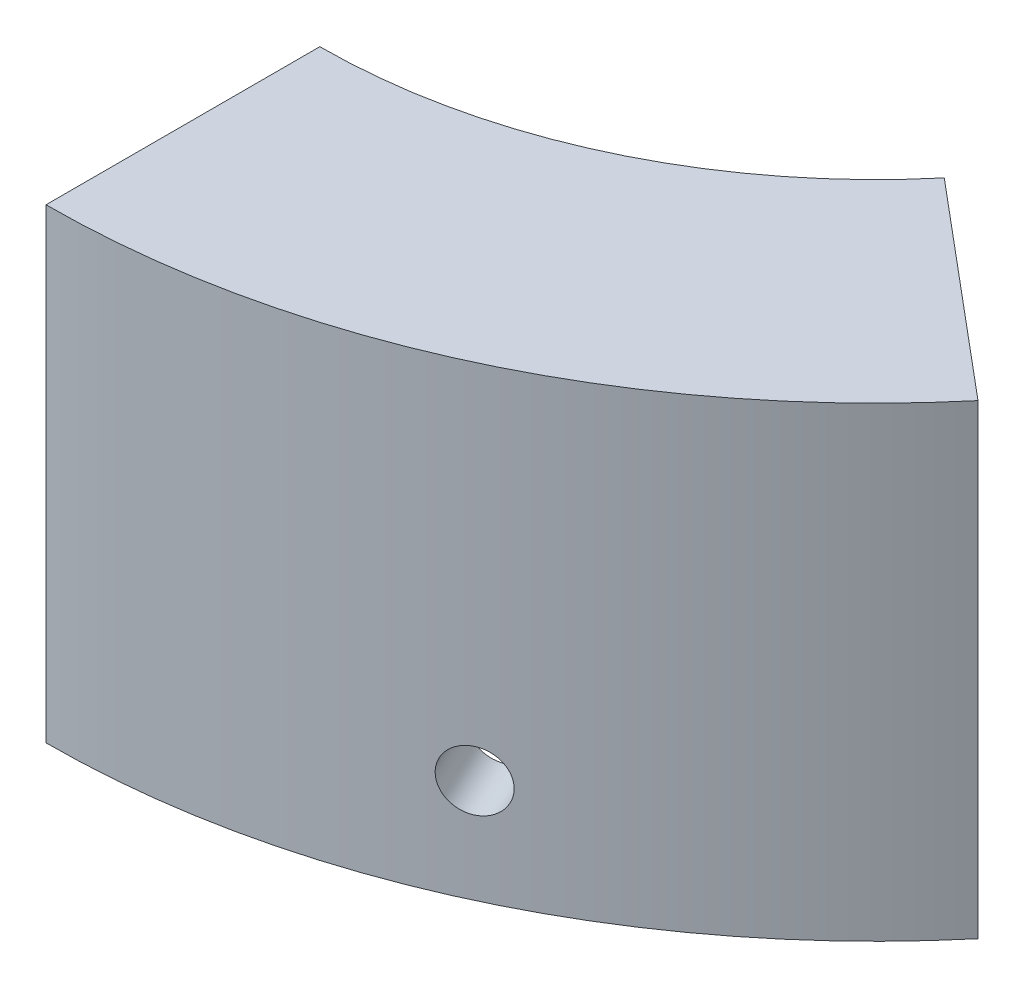
ISO-10303-21;
HEADER;
FILE_DESCRIPTION(('STEP AP214'),'2;1');
FILE_NAME('part.step','',(''),(''),'','','');
FILE_SCHEMA(('AUTOMOTIVE_DESIGN { 1 0 10303 214 1 1 1 1 }'));
ENDSEC;
DATA;
#1=APPLICATION_CONTEXT('core data for automotive mechanical design processes');
#2=APPLICATION_PROTOCOL_DEFINITION('international standard','automotive_design',2000,#1);
#3=PRODUCT_CONTEXT('',#1,'mechanical');
#4=PRODUCT('Part','Part','',(#3));
#5=PRODUCT_RELATED_PRODUCT_CATEGORY('part','',(#4));
#6=PRODUCT_DEFINITION_FORMATION('','',#4);
#7=PRODUCT_DEFINITION_CONTEXT('part definition',#1,'design');
#8=PRODUCT_DEFINITION('design','',#6,#7);
#9=PRODUCT_DEFINITION_SHAPE('','',#8);
#10=(LENGTH_UNIT() NAMED_UNIT(*) SI_UNIT(.MILLI.,.METRE.));
#11=(NAMED_UNIT(*) PLANE_ANGLE_UNIT() SI_UNIT($,.RADIAN.));
#12=(NAMED_UNIT(*) SI_UNIT($,.STERADIAN.) SOLID_ANGLE_UNIT());
#13=UNCERTAINTY_MEASURE_WITH_UNIT(LENGTH_MEASURE(1.E-05),#10,'distance_accuracy_value','');
#14=(GEOMETRIC_REPRESENTATION_CONTEXT(3) GLOBAL_UNCERTAINTY_ASSIGNED_CONTEXT((#13)) GLOBAL_UNIT_ASSIGNED_CONTEXT((#10,
#11,#12)) REPRESENTATION_CONTEXT('',''));
#15=CARTESIAN_POINT('',(0.,0.,0.));
#16=DIRECTION('',(0.,0.,1.));
#17=DIRECTION('',(1.,0.,0.));
#18=AXIS2_PLACEMENT_3D('',#15,#16,#17);
#19=CARTESIAN_POINT('',(0.,11.25,0.));
#20=DIRECTION('',(0.,-1.,0.));
#21=DIRECTION('',(0.,0.,-1.));
#22=AXIS2_PLACEMENT_3D('',#19,#20,#21);
#23=CYLINDRICAL_SURFACE('',#22,60.);
#24=DIRECTION('',(0.,-1.,0.));
#25=VECTOR('',#24,1.);
#26=CARTESIAN_POINT('',(0.,11.25,60.));
#27=LINE('',#26,#25);
#28=CARTESIAN_POINT('',(0.,11.25,60.));
#29=VERTEX_POINT('',#28);
#30=CARTESIAN_POINT('',(0.,-22.45,60.));
#31=VERTEX_POINT('',#30);
#32=EDGE_CURVE('E188',#29,#31,#27,.T.);
#33=ORIENTED_EDGE('',*,*,#32,.T.);
#34=CARTESIAN_POINT('',(0.,-22.45,0.));
#35=DIRECTION('',(0.,-1.,0.));
#36=DIRECTION('',(0.,0.,-1.));
#37=AXIS2_PLACEMENT_3D('',#34,#35,#36);
#38=CIRCLE('',#37,60.);
#39=CARTESIAN_POINT('',(45.9626665871388,-22.45,38.5672565811923));
#40=VERTEX_POINT('',#39);
#41=EDGE_CURVE('E145',#40,#31,#38,.T.);
#42=ORIENTED_EDGE('',*,*,#41,.F.);
#43=DIRECTION('',(0.,-1.,0.));
#44=VECTOR('',#43,1.);
#45=CARTESIAN_POINT('',(45.9626665871387,11.25,38.5672565811923));
#46=LINE('',#45,#44);
#47=CARTESIAN_POINT('',(45.9626665871387,11.25,38.5672565811923));
#48=VERTEX_POINT('',#47);
#49=EDGE_CURVE('E141',#48,#40,#46,.T.);
#50=ORIENTED_EDGE('',*,*,#49,.F.);
#51=CARTESIAN_POINT('',(0.,11.25,0.));
#52=DIRECTION('',(0.,1.,0.));
#53=DIRECTION('',(0.,0.,1.));
#54=AXIS2_PLACEMENT_3D('',#51,#52,#53);
#55=CIRCLE('',#54,60.);
#56=EDGE_CURVE('E166',#29,#48,#55,.T.);
#57=ORIENTED_EDGE('',*,*,#56,.F.);
#58=EDGE_LOOP('',(#33,#42,#50,#57));
#59=FACE_BOUND('',#58,.T.);
#60=CARTESIAN_POINT('',(23.3922491254643,-14.95,55.2521735396194));
#61=CARTESIAN_POINT('',(23.3922541854339,-15.0707248420507,55.2521717531925));
#62=CARTESIAN_POINT('',(23.4016513651294,-15.1915362342641,55.2481958127734));
#63=CARTESIAN_POINT('',(23.4389939015818,-15.429828956038,55.2323633417633));
#64=CARTESIAN_POINT('',(23.4669613419157,-15.5473061469481,55.220497428468));
#65=CARTESIAN_POINT('',(23.5406066530726,-15.7754439014427,55.1891423282363));
#66=CARTESIAN_POINT('',(23.5862757723697,-15.8861078021664,55.1696569082626));
#67=CARTESIAN_POINT('',(23.6939568640016,-16.0975036637949,55.1234961061498));
#68=CARTESIAN_POINT('',(23.7559648785194,-16.198238021852,55.0968224651981));
#69=CARTESIAN_POINT('',(23.8945332200248,-16.3870054728275,55.0368691597757));
#70=CARTESIAN_POINT('',(23.9711008917726,-16.4750321156179,55.003586160773));
#71=CARTESIAN_POINT('',(24.1365230414772,-16.635830823503,54.9311968676657));
#72=CARTESIAN_POINT('',(24.2253780114072,-16.7086022774988,54.8920903403871));
#73=CARTESIAN_POINT('',(24.4128028804114,-16.8368381175184,54.8089915117414));
#74=CARTESIAN_POINT('',(24.5113752076527,-16.8922981632809,54.7649979888649));
#75=CARTESIAN_POINT('',(24.7153552405868,-16.9843088158283,54.6732449126882));
#76=CARTESIAN_POINT('',(24.8207629130422,-17.0208595145535,54.6254853777004));
#77=CARTESIAN_POINT('',(25.0353281996155,-17.0739987719034,54.5274815035325));
#78=CARTESIAN_POINT('',(25.1444841696664,-17.0905959702894,54.4772382496084));
#79=CARTESIAN_POINT('',(25.3634667695889,-17.1033837281213,54.3756298426833));
#80=CARTESIAN_POINT('',(25.4732933961575,-17.0995743879957,54.324264695205));
#81=CARTESIAN_POINT('',(25.6904517219533,-17.0716644472431,54.2219060594013));
#82=CARTESIAN_POINT('',(25.7977845433253,-17.0475731620519,54.170912411291));
#83=CARTESIAN_POINT('',(26.006992899415,-16.9797976151706,54.0707848874392));
#84=CARTESIAN_POINT('',(26.1088684195068,-16.9361133009726,54.0216510166822));
#85=CARTESIAN_POINT('',(26.3043498333329,-16.8303810610633,53.9267373565924));
#86=CARTESIAN_POINT('',(26.3979538006695,-16.7683288721379,53.8809583490097));
#87=CARTESIAN_POINT('',(26.5742832138732,-16.6276254653688,53.7942110526802));
#88=CARTESIAN_POINT('',(26.6570086223979,-16.5489741905486,53.7532427804469));
#89=CARTESIAN_POINT('',(26.8093585088674,-16.3772525227586,53.6774213048454));
#90=CARTESIAN_POINT('',(26.8789755951441,-16.2841740480264,53.6425715524008));
#91=CARTESIAN_POINT('',(27.0031533694194,-16.0862686136449,53.580169404268));
#92=CARTESIAN_POINT('',(27.0577140546456,-15.9814416518322,53.5526170099235));
#93=CARTESIAN_POINT('',(27.1502977204834,-15.76301022928,53.5057383827682));
#94=CARTESIAN_POINT('',(27.188320455097,-15.649405638005,53.4864122723213));
#95=CARTESIAN_POINT('',(27.2467957832979,-15.4166458929548,53.4566479052023));
#96=CARTESIAN_POINT('',(27.2672484449549,-15.2974907606855,53.4462096140972));
#97=CARTESIAN_POINT('',(27.2900232689762,-15.05708331066,53.4345842785768));
#98=CARTESIAN_POINT('',(27.2923555089991,-14.9358321961957,53.4333920919483));
#99=CARTESIAN_POINT('',(27.2788529381853,-14.6946122999906,53.4402866537407));
#100=CARTESIAN_POINT('',(27.263018157751,-14.5746435161043,53.4483733866334));
#101=CARTESIAN_POINT('',(27.2136166684765,-14.3394253603243,53.4735432535675));
#102=CARTESIAN_POINT('',(27.1800545523551,-14.2241747743903,53.4906240574616));
#103=CARTESIAN_POINT('',(27.0961095525794,-14.0016272536743,53.5331957681873));
#104=CARTESIAN_POINT('',(27.0457266197751,-13.894330342134,53.5586866995931));
#105=CARTESIAN_POINT('',(26.929479694029,-13.6906838732884,53.6172299205547));
#106=CARTESIAN_POINT('',(26.8636088615042,-13.5943391805383,53.6502855505705));
#107=CARTESIAN_POINT('',(26.7181903019912,-13.4153809036256,53.7228526098402));
#108=CARTESIAN_POINT('',(26.6386425275199,-13.3327673671364,53.7623640615071));
#109=CARTESIAN_POINT('',(26.4680066288881,-13.1835787012585,53.8465752296335));
#110=CARTESIAN_POINT('',(26.3769132852548,-13.1170108654874,53.8912772918713));
#111=CARTESIAN_POINT('',(26.1857261034243,-13.0018530746926,53.9844333222458));
#112=CARTESIAN_POINT('',(26.0856322900676,-12.9532630700535,54.0328872800275));
#113=CARTESIAN_POINT('',(25.8792526677646,-12.8754530241962,54.1320364768231));
#114=CARTESIAN_POINT('',(25.772968371504,-12.8462282723728,54.1827311675749));
#115=CARTESIAN_POINT('',(25.5571679252394,-12.8079628745986,54.2848543488288));
#116=CARTESIAN_POINT('',(25.4476517817606,-12.7989221878986,54.3362828378491));
#117=CARTESIAN_POINT('',(25.22855067912,-12.8012820814146,54.4383580677768));
#118=CARTESIAN_POINT('',(25.1189657931168,-12.8126711877716,54.4890052313837));
#119=CARTESIAN_POINT('',(24.9027912327665,-12.8555437355981,54.5881409727783));
#120=CARTESIAN_POINT('',(24.7962015642937,-12.8870272164737,54.6366295463327));
#121=CARTESIAN_POINT('',(24.5890790970899,-12.9691929072669,54.7301572492786));
#122=CARTESIAN_POINT('',(24.4885463901186,-13.0198754079545,54.775196326415));
#123=CARTESIAN_POINT('',(24.2964509051454,-13.1389974023433,54.8606738936362));
#124=CARTESIAN_POINT('',(24.2048878147176,-13.2074362772588,54.9011125439692));
#125=CARTESIAN_POINT('',(24.0333533285727,-13.3601654899175,54.9764196972454));
#126=CARTESIAN_POINT('',(23.9533872218165,-13.444463020206,55.0112856594244));
#127=CARTESIAN_POINT('',(23.8074220173936,-13.6265269797352,55.0746130780009));
#128=CARTESIAN_POINT('',(23.741426377667,-13.7242967337284,55.1030729488865));
#129=CARTESIAN_POINT('',(23.6253342186177,-13.9305772731139,55.1529472524422));
#130=CARTESIAN_POINT('',(23.5752492183618,-14.0390957662096,55.1743565810336));
#131=CARTESIAN_POINT('',(23.4925766984614,-14.2636557336775,55.2096085748595));
#132=CARTESIAN_POINT('',(23.4599683610407,-14.3796880721617,55.2234602429517));
#133=CARTESIAN_POINT('',(23.4218401466654,-14.5720421027067,55.2396383125264));
#134=CARTESIAN_POINT('',(23.4107580872576,-14.6471158642978,55.2443342925273));
#135=CARTESIAN_POINT('',(23.395960986367,-14.7981149961081,55.250602467416));
#136=CARTESIAN_POINT('',(23.3922459417497,-14.8740403659648,55.2521746636328));
#137=CARTESIAN_POINT('',(23.3922491254643,-14.95,55.2521735396194));
#138=B_SPLINE_CURVE_WITH_KNOTS('',3,(#60,#61,#62,#63,#64,#65,#66,#67,#68,#69,#70,#71,#72,#73,
#74,#75,#76,#77,#78,#79,#80,#81,#82,#83,#84,#85,#86,#87,#88,#89,#90,#91,#92,#93,#94,#95,#96,#97,
#98,#99,#100,#101,#102,#103,#104,#105,#106,#107,#108,#109,#110,#111,#112,#113,#114,#115,#116,
#117,#118,#119,#120,#121,#122,#123,#124,#125,#126,#127,#128,#129,#130,#131,#132,#133,#134,#135,
#136,#137),.UNSPECIFIED.,.T.,.F.,(4,2,2,2,2,2,2,2,2,2,2,2,2,2,2,2,2,2,2,2,2,2,2,2,2,2,2,2,2,2,2,
2,2,2,2,2,2,2,4),(0.,0.361897258983272,0.724225655357459,1.08637514835407,1.44843699736979,
1.81068197887758,2.17294146857742,2.5352917100109,2.8976401896225,3.25983171766565,
3.62202146322321,3.98404494682679,4.34606940062871,4.70817794687758,5.07028773608951,
5.43260110831141,5.79491454724964,6.15723337532554,6.51955079970539,6.88166670709439,
7.24378200848348,7.6058035406434,7.96782613063114,8.33000889402181,8.69219291485195,
9.05454125827569,9.41688860167998,9.77914777156541,10.1414062100911,10.5034612593326,
10.8655170185841,11.2275782614049,11.5896268885744,11.9518401171281,12.314142895364,
12.6767073807731,13.0388390228668,13.2665435663526,13.4942480129584),.UNSPECIFIED.);
#139=CARTESIAN_POINT('',(23.3922491254643,-14.95,55.2521735396194));
#140=VERTEX_POINT('',#139);
#141=EDGE_CURVE('E152',#140,#140,#138,.T.);
#142=ORIENTED_EDGE('',*,*,#141,.F.);
#143=EDGE_LOOP('',(#142));
#144=FACE_BOUND('',#143,.T.);
#145=ADVANCED_FACE('F39',(#59,#144),#23,.T.);
#146=CARTESIAN_POINT('',(0.,-22.45,0.));
#147=DIRECTION('',(0.,1.,0.));
#148=DIRECTION('',(0.,0.,1.));
#149=AXIS2_PLACEMENT_3D('',#146,#147,#148);
#150=CYLINDRICAL_SURFACE('',#149,55.2);
#151=CARTESIAN_POINT('',(0.,6.25,0.));
#152=DIRECTION('',(0.,-1.,0.));
#153=DIRECTION('',(0.,0.,-1.));
#154=AXIS2_PLACEMENT_3D('',#151,#152,#153);
#155=CIRCLE('',#154,55.2);
#156=CARTESIAN_POINT('',(42.2856532601677,6.25,35.4818760546969));
#157=VERTEX_POINT('',#156);
#158=CARTESIAN_POINT('',(0.,6.25,55.2));
#159=VERTEX_POINT('',#158);
#160=EDGE_CURVE('E131',#157,#159,#155,.T.);
#161=ORIENTED_EDGE('',*,*,#160,.F.);
#162=DIRECTION('',(0.,1.,0.));
#163=VECTOR('',#162,1.);
#164=CARTESIAN_POINT('',(42.2856532601677,-22.45,35.4818760546969));
#165=LINE('',#164,#163);
#166=CARTESIAN_POINT('',(42.2856532601677,-22.45,35.4818760546969));
#167=VERTEX_POINT('',#166);
#168=EDGE_CURVE('E124',#167,#157,#165,.T.);
#169=ORIENTED_EDGE('',*,*,#168,.F.);
#170=CARTESIAN_POINT('',(0.,-22.45,0.));
#171=DIRECTION('',(0.,-1.,0.));
#172=DIRECTION('',(0.,0.,-1.));
#173=AXIS2_PLACEMENT_3D('',#170,#171,#172);
#174=CIRCLE('',#173,55.2);
#175=CARTESIAN_POINT('',(0.,-22.45,55.2));
#176=VERTEX_POINT('',#175);
#177=EDGE_CURVE('E129',#167,#176,#174,.T.);
#178=ORIENTED_EDGE('',*,*,#177,.T.);
#179=DIRECTION('',(0.,1.,0.));
#180=VECTOR('',#179,1.);
#181=CARTESIAN_POINT('',(0.,-22.45,55.2));
#182=LINE('',#181,#180);
#183=EDGE_CURVE('E134',#176,#159,#182,.T.);
#184=ORIENTED_EDGE('',*,*,#183,.T.);
#185=EDGE_LOOP('',(#161,#169,#178,#184));
#186=FACE_BOUND('',#185,.T.);
#187=CARTESIAN_POINT('',(21.3622643640661,-14.95,50.898857170272));
#188=CARTESIAN_POINT('',(21.3622694405158,-15.0707172908338,50.8988554256321));
#189=CARTESIAN_POINT('',(21.3716789911995,-15.1915209472526,50.8949090210859));
#190=CARTESIAN_POINT('',(21.4090693215218,-15.4297978923482,50.8791916819157));
#191=CARTESIAN_POINT('',(21.4370721682093,-15.5472670505989,50.8674114498586));
#192=CARTESIAN_POINT('',(21.5108063948959,-15.7753886985463,50.8362744564915));
#193=CARTESIAN_POINT('',(21.556528961326,-15.8860445454403,50.8169214617335));
#194=CARTESIAN_POINT('',(21.6643282349254,-16.0974258952511,50.7710576658738));
#195=CARTESIAN_POINT('',(21.726401000763,-16.1981537833423,50.7445485897579));
#196=CARTESIAN_POINT('',(21.8651074100081,-16.386918079417,50.6849362480143));
#197=CARTESIAN_POINT('',(21.9417494579048,-16.4749471100826,50.6518291757064));
#198=CARTESIAN_POINT('',(22.1073176286763,-16.6357523274736,50.5797849021829));
#199=CARTESIAN_POINT('',(22.1962442451878,-16.7085279009658,50.5408474666776));
#200=CARTESIAN_POINT('',(22.3838065423846,-16.8367769812635,50.4580588232859));
#201=CARTESIAN_POINT('',(22.4824451223515,-16.8922453006613,50.4142061475244));
#202=CARTESIAN_POINT('',(22.6865409113032,-16.9842718698095,50.3226922596357));
#203=CARTESIAN_POINT('',(22.791998083599,-17.0208302213001,50.2750310680008));
#204=CARTESIAN_POINT('',(23.0066314595807,-17.0739811439652,50.1771741441197));
#205=CARTESIAN_POINT('',(23.1158057314189,-17.090583928341,50.126979722092));
#206=CARTESIAN_POINT('',(23.3347991188611,-17.1033839191848,50.0254107089069));
#207=CARTESIAN_POINT('',(23.4446182309236,-17.0995812376133,49.9740361242263));
#208=CARTESIAN_POINT('',(23.6617267213326,-17.0716867802583,49.8716060703064));
#209=CARTESIAN_POINT('',(23.7690174395056,-17.04760601046,49.8205504430922));
#210=CARTESIAN_POINT('',(23.9781204132354,-16.9798559848806,49.7202493672024));
#211=CARTESIAN_POINT('',(24.0799326525108,-16.9361866708882,49.6710039239064));
#212=CARTESIAN_POINT('',(24.2752775540777,-16.8304865683802,49.5758279947255));
#213=CARTESIAN_POINT('',(24.3688079378394,-16.7684507470791,49.5298984217509));
#214=CARTESIAN_POINT('',(24.5449845787538,-16.6277823033014,49.4428296484158));
#215=CARTESIAN_POINT('',(24.6276307909703,-16.549149612307,49.4016904678329));
#216=CARTESIAN_POINT('',(24.7798343877172,-16.3774572583098,49.3255215086198));
#217=CARTESIAN_POINT('',(24.849383042005,-16.2843880474035,49.2904958060887));
#218=CARTESIAN_POINT('',(24.973434547175,-16.0864981667477,49.2277606111358));
#219=CARTESIAN_POINT('',(25.0279373950865,-15.981677494678,49.2000511201583));
#220=CARTESIAN_POINT('',(25.120423476875,-15.763254589533,49.1528944476081));
#221=CARTESIAN_POINT('',(25.1584064139596,-15.6496521987308,49.1334474144767));
#222=CARTESIAN_POINT('',(25.216825013252,-15.4168931317498,49.1034909472003));
#223=CARTESIAN_POINT('',(25.2372607556765,-15.2977364809648,49.0929814721975));
#224=CARTESIAN_POINT('',(25.2600260401029,-15.0573351819678,49.0812719054578));
#225=CARTESIAN_POINT('',(25.2623674707566,-14.9360919572149,49.0800657011189));
#226=CARTESIAN_POINT('',(25.2489123611905,-14.6948854804683,49.0869889035784));
#227=CARTESIAN_POINT('',(25.2331158569941,-14.574922225933,49.0951182918356));
#228=CARTESIAN_POINT('',(25.1838184577965,-14.339718375219,49.1204239319036));
#229=CARTESIAN_POINT('',(25.1503229870618,-14.2244763437634,49.1375974119335));
#230=CARTESIAN_POINT('',(25.0665337704626,-14.0019421093365,49.1803932988871));
#231=CARTESIAN_POINT('',(25.0162399662586,-13.8946499339761,49.2060157351536));
#232=CARTESIAN_POINT('',(24.9001810184495,-13.690999539408,49.2648475496869));
#233=CARTESIAN_POINT('',(24.8344078033248,-13.5946470635407,49.2980608858593));
#234=CARTESIAN_POINT('',(24.6891866292014,-13.4156688832327,49.3709494187668));
#235=CARTESIAN_POINT('',(24.6097386150886,-13.3330432341184,49.4106246415456));
#236=CARTESIAN_POINT('',(24.4392869135116,-13.1838194413456,49.4951542324858));
#237=CARTESIAN_POINT('',(24.348277051962,-13.1172299164808,49.5400113666452));
#238=CARTESIAN_POINT('',(24.157237498651,-13.0020275133764,49.6334480778319));
#239=CARTESIAN_POINT('',(24.0572078345509,-12.9534145800098,49.6820276434435));
#240=CARTESIAN_POINT('',(23.8509347435121,-12.8755604131166,49.781382084593));
#241=CARTESIAN_POINT('',(23.7446931082972,-12.8463136235015,49.8321563260278));
#242=CARTESIAN_POINT('',(23.5289482098183,-12.8080037451981,49.9343853426438));
#243=CARTESIAN_POINT('',(23.4194449554035,-12.7989406017547,49.9858401159784));
#244=CARTESIAN_POINT('',(23.2003503259431,-12.8012559096318,50.0879061311319));
#245=CARTESIAN_POINT('',(23.0907590574566,-12.8126208120851,50.1385179095972));
#246=CARTESIAN_POINT('',(22.874542823071,-12.8554416696801,50.2375301448695));
#247=CARTESIAN_POINT('',(22.7679178629521,-12.8868976639688,50.2859305973678));
#248=CARTESIAN_POINT('',(22.5607000357985,-12.9690053842659,50.3792391456441));
#249=CARTESIAN_POINT('',(22.4601072531721,-13.0196573788116,50.4241471925556));
#250=CARTESIAN_POINT('',(22.2678724858564,-13.1387160718354,50.5093350047404));
#251=CARTESIAN_POINT('',(22.1762301965425,-13.2071221657736,50.5496149275374));
#252=CARTESIAN_POINT('',(22.0045167398937,-13.3597926530075,50.6245991794193));
#253=CARTESIAN_POINT('',(21.9244520333264,-13.4440658408754,50.6593003965548));
#254=CARTESIAN_POINT('',(21.7782890954002,-13.6260847085943,50.7223074909036));
#255=CARTESIAN_POINT('',(21.7121943185973,-13.7238337109633,50.7506117863728));
#256=CARTESIAN_POINT('',(21.5959097870859,-13.9300825186774,50.8002036647812));
#257=CARTESIAN_POINT('',(21.54573227728,-14.0385905169322,50.8214858462215));
#258=CARTESIAN_POINT('',(21.4628934933082,-14.2631362674082,50.8565260806417));
#259=CARTESIAN_POINT('',(21.4302114078631,-14.3791648885453,50.8702930735277));
#260=CARTESIAN_POINT('',(21.3919671505231,-14.5716015509966,50.8863830453759));
#261=CARTESIAN_POINT('',(21.3808433136291,-14.6467614986251,50.8910562393931));
#262=CARTESIAN_POINT('',(21.3659903232497,-14.7979362058161,50.8972938505956));
#263=CARTESIAN_POINT('',(21.3622611660229,-14.8739509649459,50.8988582693539));
#264=CARTESIAN_POINT('',(21.3622643640661,-14.95,50.898857170272));
#265=B_SPLINE_CURVE_WITH_KNOTS('',3,(#187,#188,#189,#190,#191,#192,#193,#194,#195,#196,#197,
#198,#199,#200,#201,#202,#203,#204,#205,#206,#207,#208,#209,#210,#211,#212,#213,#214,#215,#216,
#217,#218,#219,#220,#221,#222,#223,#224,#225,#226,#227,#228,#229,#230,#231,#232,#233,#234,#235,
#236,#237,#238,#239,#240,#241,#242,#243,#244,#245,#246,#247,#248,#249,#250,#251,#252,#253,#254,
#255,#256,#257,#258,#259,#260,#261,#262,#263,#264),.UNSPECIFIED.,.T.,.F.,(4,2,2,2,2,2,2,2,2,2,2,
2,2,2,2,2,2,2,2,2,2,2,2,2,2,2,2,2,2,2,2,2,2,2,2,2,2,2,4),(0.,0.361874276229291,
0.724178804587717,1.08630335796686,1.44834069841001,1.81058752230407,2.17284890677703,
2.53521876578399,2.89758667513078,3.25976904655569,3.62194943076489,3.98393336723073,
4.3459183794131,4.70800267458692,5.07008846460504,5.43241475701872,5.79474112096663,
6.15707399410755,6.51940521084222,6.8814983419142,7.24359075384431,7.60557225831011,
7.96755501992841,8.32972695217413,8.69190034412905,9.05426795794164,9.41663446050764,
9.77889695611439,10.1411584689594,10.5031798011143,10.8652018386611,11.227228940802,
11.589243717273,11.9514597396554,12.3137652281513,12.6763487604115,13.0385000259541,
13.2664723673809,13.4944445934643),.UNSPECIFIED.);
#266=CARTESIAN_POINT('',(21.3622643640661,-14.95,50.898857170272));
#267=VERTEX_POINT('',#266);
#268=EDGE_CURVE('E43',#267,#267,#265,.T.);
#269=ORIENTED_EDGE('',*,*,#268,.T.);
#270=EDGE_LOOP('',(#269));
#271=FACE_BOUND('',#270,.T.);
#272=ADVANCED_FACE('F126',(#186,#271),#150,.F.);
#273=CARTESIAN_POINT('',(0.,6.25,0.));
#274=DIRECTION('',(0.,-1.,0.));
#275=DIRECTION('',(0.,0.,-1.));
#276=AXIS2_PLACEMENT_3D('',#273,#274,#275);
#277=CYLINDRICAL_SURFACE('',#276,43.2);
#278=CARTESIAN_POINT('',(0.,0.,0.));
#279=DIRECTION('',(0.,1.,0.));
#280=DIRECTION('',(0.,0.,1.));
#281=AXIS2_PLACEMENT_3D('',#278,#279,#280);
#282=CIRCLE('',#281,43.2);
#283=CARTESIAN_POINT('',(0.,0.,43.2));
#284=VERTEX_POINT('',#283);
#285=CARTESIAN_POINT('',(33.0931199427399,0.,27.7684247384584));
#286=VERTEX_POINT('',#285);
#287=EDGE_CURVE('E190',#284,#286,#282,.T.);
#288=ORIENTED_EDGE('',*,*,#287,.F.);
#289=DIRECTION('',(0.,-1.,0.));
#290=VECTOR('',#289,1.);
#291=CARTESIAN_POINT('',(0.,6.25,43.2));
#292=LINE('',#291,#290);
#293=CARTESIAN_POINT('',(0.,6.25,43.2));
#294=VERTEX_POINT('',#293);
#295=EDGE_CURVE('E11',#294,#284,#292,.T.);
#296=ORIENTED_EDGE('',*,*,#295,.F.);
#297=CARTESIAN_POINT('',(0.,6.25,0.));
#298=DIRECTION('',(0.,1.,0.));
#299=DIRECTION('',(0.,0.,1.));
#300=AXIS2_PLACEMENT_3D('',#297,#298,#299);
#301=CIRCLE('',#300,43.2);
#302=CARTESIAN_POINT('',(33.0931199427399,6.25,27.7684247384584));
#303=VERTEX_POINT('',#302);
#304=EDGE_CURVE('E191',#294,#303,#301,.T.);
#305=ORIENTED_EDGE('',*,*,#304,.T.);
#306=DIRECTION('',(0.,-1.,0.));
#307=VECTOR('',#306,1.);
#308=CARTESIAN_POINT('',(33.0931199427399,6.25,27.7684247384584));
#309=LINE('',#308,#307);
#310=EDGE_CURVE('E62',#303,#286,#309,.T.);
#311=ORIENTED_EDGE('',*,*,#310,.T.);
#312=EDGE_LOOP('',(#288,#296,#305,#311));
#313=FACE_BOUND('',#312,.T.);
#314=ADVANCED_FACE('F41',(#313),#277,.F.);
#315=CARTESIAN_POINT('',(0.,6.25,0.));
#316=DIRECTION('',(1.,0.,0.));
#317=DIRECTION('',(0.,0.,-1.));
#318=AXIS2_PLACEMENT_3D('',#315,#316,#317);
#319=PLANE('',#318);
#320=DIRECTION('',(0.,0.,1.));
#321=VECTOR('',#320,1.);
#322=CARTESIAN_POINT('',(0.,0.,0.));
#323=LINE('',#322,#321);
#324=CARTESIAN_POINT('',(0.,0.,46.8));
#325=VERTEX_POINT('',#324);
#326=EDGE_CURVE('E198',#284,#325,#323,.T.);
#327=ORIENTED_EDGE('',*,*,#326,.T.);
#328=DIRECTION('',(0.,-1.,0.));
#329=VECTOR('',#328,1.);
#330=CARTESIAN_POINT('',(0.,6.25,46.8));
#331=LINE('',#330,#329);
#332=CARTESIAN_POINT('',(0.,6.25,46.8));
#333=VERTEX_POINT('',#332);
#334=EDGE_CURVE('E54',#333,#325,#331,.T.);
#335=ORIENTED_EDGE('',*,*,#334,.F.);
#336=DIRECTION('',(0.,0.,1.));
#337=VECTOR('',#336,1.);
#338=CARTESIAN_POINT('',(0.,6.25,0.));
#339=LINE('',#338,#337);
#340=EDGE_CURVE('E133',#333,#159,#339,.T.);
#341=ORIENTED_EDGE('',*,*,#340,.T.);
#342=ORIENTED_EDGE('',*,*,#183,.F.);
#343=DIRECTION('',(0.,0.,-1.));
#344=VECTOR('',#343,1.);
#345=CARTESIAN_POINT('',(0.,-22.45,0.));
#346=LINE('',#345,#344);
#347=EDGE_CURVE('E149',#31,#176,#346,.T.);
#348=ORIENTED_EDGE('',*,*,#347,.F.);
#349=ORIENTED_EDGE('',*,*,#32,.F.);
#350=DIRECTION('',(0.,0.,1.));
#351=VECTOR('',#350,1.);
#352=CARTESIAN_POINT('',(0.,11.25,0.));
#353=LINE('',#352,#351);
#354=CARTESIAN_POINT('',(0.,11.25,40.2));
#355=VERTEX_POINT('',#354);
#356=EDGE_CURVE('E163',#355,#29,#353,.T.);
#357=ORIENTED_EDGE('',*,*,#356,.F.);
#358=DIRECTION('',(0.,-1.,0.));
#359=VECTOR('',#358,1.);
#360=CARTESIAN_POINT('',(0.,11.25,40.2));
#361=LINE('',#360,#359);
#362=CARTESIAN_POINT('',(0.,6.25,40.2));
#363=VERTEX_POINT('',#362);
#364=EDGE_CURVE('E174',#355,#363,#361,.T.);
#365=ORIENTED_EDGE('',*,*,#364,.T.);
#366=EDGE_CURVE('E175',#363,#294,#339,.T.);
#367=ORIENTED_EDGE('',*,*,#366,.T.);
#368=ORIENTED_EDGE('',*,*,#295,.T.);
#369=EDGE_LOOP('',(#327,#335,#341,#342,#348,#349,#357,#365,#367,#368));
#370=FACE_BOUND('',#369,.T.);
#371=ADVANCED_FACE('F218',(#370),#319,.F.);
#372=CARTESIAN_POINT('',(0.,6.25,0.));
#373=DIRECTION('',(0.,-1.,0.));
#374=DIRECTION('',(0.,0.,-1.));
#375=AXIS2_PLACEMENT_3D('',#372,#373,#374);
#376=CYLINDRICAL_SURFACE('',#375,46.8);
#377=CARTESIAN_POINT('',(0.,0.,0.));
#378=DIRECTION('',(0.,1.,0.));
#379=DIRECTION('',(0.,0.,1.));
#380=AXIS2_PLACEMENT_3D('',#377,#378,#379);
#381=CIRCLE('',#380,46.8);
#382=CARTESIAN_POINT('',(35.8508799379682,0.,30.08246013333));
#383=VERTEX_POINT('',#382);
#384=EDGE_CURVE('E200',#325,#383,#381,.T.);
#385=ORIENTED_EDGE('',*,*,#384,.T.);
#386=DIRECTION('',(0.,-1.,0.));
#387=VECTOR('',#386,1.);
#388=CARTESIAN_POINT('',(35.8508799379682,6.25,30.08246013333));
#389=LINE('',#388,#387);
#390=CARTESIAN_POINT('',(35.8508799379682,6.25,30.08246013333));
#391=VERTEX_POINT('',#390);
#392=EDGE_CURVE('E78',#391,#383,#389,.T.);
#393=ORIENTED_EDGE('',*,*,#392,.F.);
#394=CARTESIAN_POINT('',(0.,6.25,0.));
#395=DIRECTION('',(0.,1.,0.));
#396=DIRECTION('',(0.,0.,1.));
#397=AXIS2_PLACEMENT_3D('',#394,#395,#396);
#398=CIRCLE('',#397,46.8);
#399=EDGE_CURVE('E193',#333,#391,#398,.T.);
#400=ORIENTED_EDGE('',*,*,#399,.F.);
#401=ORIENTED_EDGE('',*,*,#334,.T.);
#402=EDGE_LOOP('',(#385,#393,#400,#401));
#403=FACE_BOUND('',#402,.T.);
#404=ADVANCED_FACE('F210',(#403),#376,.T.);
#405=CARTESIAN_POINT('',(0.,6.25,0.));
#406=DIRECTION('',(0.642787609686539,0.,-0.766044443118979));
#407=DIRECTION('',(-0.766044443118979,0.,-0.642787609686538));
#408=AXIS2_PLACEMENT_3D('',#405,#406,#407);
#409=PLANE('',#408);
#410=DIRECTION('',(0.766044443118979,0.,0.642787609686539));
#411=VECTOR('',#410,1.);
#412=CARTESIAN_POINT('',(0.,0.,0.));
#413=LINE('',#412,#411);
#414=EDGE_CURVE('E194',#286,#383,#413,.T.);
#415=ORIENTED_EDGE('',*,*,#414,.F.);
#416=ORIENTED_EDGE('',*,*,#310,.F.);
#417=DIRECTION('',(-0.766044443118978,0.,-0.642787609686539));
#418=VECTOR('',#417,1.);
#419=CARTESIAN_POINT('',(0.,6.25,0.));
#420=LINE('',#419,#418);
#421=CARTESIAN_POINT('',(30.794986613383,6.25,25.8400619093988));
#422=VERTEX_POINT('',#421);
#423=EDGE_CURVE('E178',#303,#422,#420,.T.);
#424=ORIENTED_EDGE('',*,*,#423,.T.);
#425=DIRECTION('',(0.,-1.,0.));
#426=VECTOR('',#425,1.);
#427=CARTESIAN_POINT('',(30.794986613383,11.25,25.8400619093988));
#428=LINE('',#427,#426);
#429=CARTESIAN_POINT('',(30.794986613383,11.25,25.8400619093988));
#430=VERTEX_POINT('',#429);
#431=EDGE_CURVE('E184',#430,#422,#428,.T.);
#432=ORIENTED_EDGE('',*,*,#431,.F.);
#433=DIRECTION('',(-0.766044443118978,0.,-0.642787609686539));
#434=VECTOR('',#433,1.);
#435=CARTESIAN_POINT('',(0.,11.25,0.));
#436=LINE('',#435,#434);
#437=EDGE_CURVE('E169',#48,#430,#436,.T.);
#438=ORIENTED_EDGE('',*,*,#437,.F.);
#439=ORIENTED_EDGE('',*,*,#49,.T.);
#440=DIRECTION('',(0.766044443118978,0.,0.642787609686539));
#441=VECTOR('',#440,1.);
#442=CARTESIAN_POINT('',(0.,-22.45,0.));
#443=LINE('',#442,#441);
#444=EDGE_CURVE('E137',#167,#40,#443,.T.);
#445=ORIENTED_EDGE('',*,*,#444,.F.);
#446=ORIENTED_EDGE('',*,*,#168,.T.);
#447=EDGE_CURVE('E179',#157,#391,#420,.T.);
#448=ORIENTED_EDGE('',*,*,#447,.T.);
#449=ORIENTED_EDGE('',*,*,#392,.T.);
#450=EDGE_LOOP('',(#415,#416,#424,#432,#438,#439,#445,#446,#448,#449));
#451=FACE_BOUND('',#450,.T.);
#452=ADVANCED_FACE('F138',(#451),#409,.T.);
#453=CARTESIAN_POINT('',(0.,0.,0.));
#454=DIRECTION('',(0.,1.,0.));
#455=DIRECTION('',(0.,0.,1.));
#456=AXIS2_PLACEMENT_3D('',#453,#454,#455);
#457=PLANE('',#456);
#458=ORIENTED_EDGE('',*,*,#287,.T.);
#459=ORIENTED_EDGE('',*,*,#414,.T.);
#460=ORIENTED_EDGE('',*,*,#384,.F.);
#461=ORIENTED_EDGE('',*,*,#326,.F.);
#462=EDGE_LOOP('',(#458,#459,#460,#461));
#463=FACE_BOUND('',#462,.T.);
#464=ADVANCED_FACE('F216',(#463),#457,.F.);
#465=CARTESIAN_POINT('',(0.,6.25,0.));
#466=DIRECTION('',(0.,1.,0.));
#467=DIRECTION('',(0.,0.,1.));
#468=AXIS2_PLACEMENT_3D('',#465,#466,#467);
#469=PLANE('',#468);
#470=ORIENTED_EDGE('',*,*,#304,.F.);
#471=ORIENTED_EDGE('',*,*,#366,.F.);
#472=CARTESIAN_POINT('',(0.,6.25,0.));
#473=DIRECTION('',(0.,1.,0.));
#474=DIRECTION('',(0.,0.,1.));
#475=AXIS2_PLACEMENT_3D('',#472,#473,#474);
#476=CIRCLE('',#475,40.2);
#477=EDGE_CURVE('E167',#363,#422,#476,.T.);
#478=ORIENTED_EDGE('',*,*,#477,.T.);
#479=ORIENTED_EDGE('',*,*,#423,.F.);
#480=EDGE_LOOP('',(#470,#471,#478,#479));
#481=FACE_BOUND('',#480,.T.);
#482=ADVANCED_FACE('F236',(#481),#469,.F.);
#483=CARTESIAN_POINT('',(0.,11.25,0.));
#484=DIRECTION('',(0.,-1.,0.));
#485=DIRECTION('',(0.,0.,-1.));
#486=AXIS2_PLACEMENT_3D('',#483,#484,#485);
#487=CYLINDRICAL_SURFACE('',#486,40.2);
#488=ORIENTED_EDGE('',*,*,#477,.F.);
#489=ORIENTED_EDGE('',*,*,#364,.F.);
#490=CARTESIAN_POINT('',(0.,11.25,0.));
#491=DIRECTION('',(0.,1.,0.));
#492=DIRECTION('',(0.,0.,1.));
#493=AXIS2_PLACEMENT_3D('',#490,#491,#492);
#494=CIRCLE('',#493,40.2);
#495=EDGE_CURVE('E171',#355,#430,#494,.T.);
#496=ORIENTED_EDGE('',*,*,#495,.T.);
#497=ORIENTED_EDGE('',*,*,#431,.T.);
#498=EDGE_LOOP('',(#488,#489,#496,#497));
#499=FACE_BOUND('',#498,.T.);
#500=ADVANCED_FACE('F232',(#499),#487,.F.);
#501=CARTESIAN_POINT('',(0.,11.25,0.));
#502=DIRECTION('',(0.,1.,0.));
#503=DIRECTION('',(0.,0.,1.));
#504=AXIS2_PLACEMENT_3D('',#501,#502,#503);
#505=PLANE('',#504);
#506=ORIENTED_EDGE('',*,*,#356,.T.);
#507=ORIENTED_EDGE('',*,*,#56,.T.);
#508=ORIENTED_EDGE('',*,*,#437,.T.);
#509=ORIENTED_EDGE('',*,*,#495,.F.);
#510=EDGE_LOOP('',(#506,#507,#508,#509));
#511=FACE_BOUND('',#510,.T.);
#512=ADVANCED_FACE('F266',(#511),#505,.T.);
#513=ORIENTED_EDGE('',*,*,#447,.F.);
#514=ORIENTED_EDGE('',*,*,#160,.T.);
#515=ORIENTED_EDGE('',*,*,#340,.F.);
#516=ORIENTED_EDGE('',*,*,#399,.T.);
#517=EDGE_LOOP('',(#513,#514,#515,#516));
#518=FACE_BOUND('',#517,.T.);
#519=ADVANCED_FACE('F260',(#518),#469,.F.);
#520=CARTESIAN_POINT('',(0.,-22.45,0.));
#521=DIRECTION('',(0.,-1.,0.));
#522=DIRECTION('',(0.,0.,-1.));
#523=AXIS2_PLACEMENT_3D('',#520,#521,#522);
#524=PLANE('',#523);
#525=ORIENTED_EDGE('',*,*,#177,.F.);
#526=ORIENTED_EDGE('',*,*,#444,.T.);
#527=ORIENTED_EDGE('',*,*,#41,.T.);
#528=ORIENTED_EDGE('',*,*,#347,.T.);
#529=EDGE_LOOP('',(#525,#526,#527,#528));
#530=FACE_BOUND('',#529,.T.);
#531=ADVANCED_FACE('F147',(#530),#524,.T.);
#532=CARTESIAN_POINT('',(31.1905502919557,-14.95,66.8883509556001));
#533=DIRECTION('',(-0.422618261740701,0.,-0.906307787036649));
#534=DIRECTION('',(-0.906307787036649,0.,0.422618261740701));
#535=AXIS2_PLACEMENT_3D('',#532,#533,#534);
#536=CYLINDRICAL_SURFACE('',#535,2.15);
#537=ORIENTED_EDGE('',*,*,#268,.F.);
#538=EDGE_LOOP('',(#537));
#539=FACE_BOUND('',#538,.T.);
#540=ORIENTED_EDGE('',*,*,#141,.T.);
#541=EDGE_LOOP('',(#540));
#542=FACE_BOUND('',#541,.T.);
#543=ADVANCED_FACE('F284',(#539,#542),#536,.F.);
#544=CLOSED_SHELL('',(#145,#272,#314,#371,#404,#452,#464,#482,#500,#512,#519,#531,#543));
#545=MANIFOLD_SOLID_BREP('B2',#544);
#546=ADVANCED_BREP_SHAPE_REPRESENTATION('',(#18,#545),#14);
#547=SHAPE_DEFINITION_REPRESENTATION(#9,#546);
ENDSEC;
END-ISO-10303-21;
